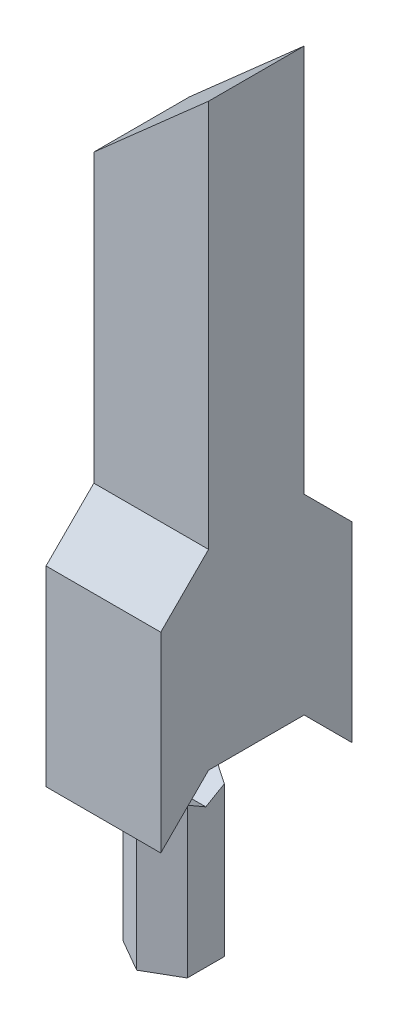
ISO-10303-21;
HEADER;
FILE_DESCRIPTION(('STEP AP214'),'2;1');
FILE_NAME('part.step','',(''),(''),'','','');
FILE_SCHEMA(('AUTOMOTIVE_DESIGN { 1 0 10303 214 1 1 1 1 }'));
ENDSEC;
DATA;
#1=APPLICATION_CONTEXT('core data for automotive mechanical design processes');
#2=APPLICATION_PROTOCOL_DEFINITION('international standard','automotive_design',2000,#1);
#3=PRODUCT_CONTEXT('',#1,'mechanical');
#4=PRODUCT('Part','Part','',(#3));
#5=PRODUCT_RELATED_PRODUCT_CATEGORY('part','',(#4));
#6=PRODUCT_DEFINITION_FORMATION('','',#4);
#7=PRODUCT_DEFINITION_CONTEXT('part definition',#1,'design');
#8=PRODUCT_DEFINITION('design','',#6,#7);
#9=PRODUCT_DEFINITION_SHAPE('','',#8);
#10=(LENGTH_UNIT() NAMED_UNIT(*) SI_UNIT(.MILLI.,.METRE.));
#11=(NAMED_UNIT(*) PLANE_ANGLE_UNIT() SI_UNIT($,.RADIAN.));
#12=(NAMED_UNIT(*) SI_UNIT($,.STERADIAN.) SOLID_ANGLE_UNIT());
#13=UNCERTAINTY_MEASURE_WITH_UNIT(LENGTH_MEASURE(1.E-05),#10,'distance_accuracy_value','');
#14=(GEOMETRIC_REPRESENTATION_CONTEXT(3) GLOBAL_UNCERTAINTY_ASSIGNED_CONTEXT((#13)) GLOBAL_UNIT_ASSIGNED_CONTEXT((#10,
#11,#12)) REPRESENTATION_CONTEXT('',''));
#15=CARTESIAN_POINT('',(0.,0.,0.));
#16=DIRECTION('',(0.,0.,1.));
#17=DIRECTION('',(1.,0.,0.));
#18=AXIS2_PLACEMENT_3D('',#15,#16,#17);
#19=CARTESIAN_POINT('',(0.,0.,-5.));
#20=DIRECTION('',(0.,0.,-1.));
#21=DIRECTION('',(-1.,0.,0.));
#22=AXIS2_PLACEMENT_3D('',#19,#20,#21);
#23=PLANE('',#22);
#24=DIRECTION('',(0.,1.,0.));
#25=VECTOR('',#24,1.);
#26=CARTESIAN_POINT('',(8.64415156033534,60.6066017177983,-5.));
#27=LINE('',#26,#25);
#28=CARTESIAN_POINT('',(8.64415156033527,20.0032863485874,-5.00000000000006));
#29=VERTEX_POINT('',#28);
#30=CARTESIAN_POINT('',(8.64415156033534,60.6066017177983,-5.));
#31=VERTEX_POINT('',#30);
#32=EDGE_CURVE('E305',#29,#31,#27,.T.);
#33=ORIENTED_EDGE('',*,*,#32,.F.);
#34=DIRECTION('',(-1.,0.,0.));
#35=VECTOR('',#34,1.);
#36=CARTESIAN_POINT('',(8.64415156033527,20.0032863485874,-5.00000000000006));
#37=LINE('',#36,#35);
#38=CARTESIAN_POINT('',(-3.35584843966466,20.0032863485874,-5.));
#39=VERTEX_POINT('',#38);
#40=EDGE_CURVE('E223',#29,#39,#37,.T.);
#41=ORIENTED_EDGE('',*,*,#40,.T.);
#42=DIRECTION('',(0.,-1.,0.));
#43=VECTOR('',#42,1.);
#44=CARTESIAN_POINT('',(-3.35584843966466,0.,-5.));
#45=LINE('',#44,#43);
#46=CARTESIAN_POINT('',(-3.35584843966466,50.,-5.));
#47=VERTEX_POINT('',#46);
#48=EDGE_CURVE('E293',#47,#39,#45,.T.);
#49=ORIENTED_EDGE('',*,*,#48,.F.);
#50=DIRECTION('',(-0.749268649265351,-0.662266178532526,0.));
#51=VECTOR('',#50,1.);
#52=CARTESIAN_POINT('',(-3.35584843966466,50.,-5.));
#53=LINE('',#52,#51);
#54=EDGE_CURVE('E308',#31,#47,#53,.T.);
#55=ORIENTED_EDGE('',*,*,#54,.F.);
#56=EDGE_LOOP('',(#33,#41,#49,#55));
#57=FACE_BOUND('',#56,.T.);
#58=ADVANCED_FACE('F39',(#57),#23,.T.);
#59=CARTESIAN_POINT('',(0.,0.,5.));
#60=DIRECTION('',(0.,0.,-1.));
#61=DIRECTION('',(-1.,0.,0.));
#62=AXIS2_PLACEMENT_3D('',#59,#60,#61);
#63=PLANE('',#62);
#64=DIRECTION('',(-1.,0.,0.));
#65=VECTOR('',#64,1.);
#66=CARTESIAN_POINT('',(8.64415156033537,20.0032863485874,4.99999999999988));
#67=LINE('',#66,#65);
#68=CARTESIAN_POINT('',(8.64415156033535,20.0032863485874,5.));
#69=VERTEX_POINT('',#68);
#70=CARTESIAN_POINT('',(-3.35584843966463,20.0032863485874,5.));
#71=VERTEX_POINT('',#70);
#72=EDGE_CURVE('E63',#69,#71,#67,.T.);
#73=ORIENTED_EDGE('',*,*,#72,.F.);
#74=DIRECTION('',(0.,1.,0.));
#75=VECTOR('',#74,1.);
#76=CARTESIAN_POINT('',(8.64415156033534,60.6066017177983,5.));
#77=LINE('',#76,#75);
#78=CARTESIAN_POINT('',(8.64415156033534,60.6066017177983,5.));
#79=VERTEX_POINT('',#78);
#80=EDGE_CURVE('E292',#69,#79,#77,.T.);
#81=ORIENTED_EDGE('',*,*,#80,.T.);
#82=DIRECTION('',(-0.749268649265351,-0.662266178532526,0.));
#83=VECTOR('',#82,1.);
#84=CARTESIAN_POINT('',(-3.35584843966466,50.,5.));
#85=LINE('',#84,#83);
#86=CARTESIAN_POINT('',(-3.35584843966466,50.,5.));
#87=VERTEX_POINT('',#86);
#88=EDGE_CURVE('E296',#79,#87,#85,.T.);
#89=ORIENTED_EDGE('',*,*,#88,.T.);
#90=DIRECTION('',(0.,-1.,0.));
#91=VECTOR('',#90,1.);
#92=CARTESIAN_POINT('',(-3.35584843966466,0.,5.));
#93=LINE('',#92,#91);
#94=EDGE_CURVE('E299',#87,#71,#93,.T.);
#95=ORIENTED_EDGE('',*,*,#94,.T.);
#96=EDGE_LOOP('',(#73,#81,#89,#95));
#97=FACE_BOUND('',#96,.T.);
#98=ADVANCED_FACE('F524',(#97),#63,.F.);
#99=CARTESIAN_POINT('',(6.64415156033532,-5.,0.));
#100=DIRECTION('',(-1.,0.,0.));
#101=DIRECTION('',(0.,0.,1.));
#102=AXIS2_PLACEMENT_3D('',#99,#100,#101);
#103=CYLINDRICAL_SURFACE('',#102,2.);
#104=CARTESIAN_POINT('',(-6.71169687932933,-5.,0.));
#105=DIRECTION('',(-0.499999999999995,0.,0.866025403784441));
#106=DIRECTION('',(-0.866025403784442,0.,-0.499999999999995));
#107=AXIS2_PLACEMENT_3D('',#104,#105,#106);
#108=ELLIPSE('',#107,3.99999999999997,2.);
#109=CARTESIAN_POINT('',(-3.35584843966466,-5.49607837082464,1.93750000000003));
#110=VERTEX_POINT('',#109);
#111=CARTESIAN_POINT('',(-3.35584843966466,-4.50392162917536,1.93750000000003));
#112=VERTEX_POINT('',#111);
#113=EDGE_CURVE('E399',#110,#112,#108,.T.);
#114=ORIENTED_EDGE('',*,*,#113,.T.);
#115=CARTESIAN_POINT('',(-3.35584843966468,-5.,0.));
#116=DIRECTION('',(-1.,0.,0.));
#117=DIRECTION('',(0.,0.,1.));
#118=AXIS2_PLACEMENT_3D('',#115,#116,#117);
#119=CIRCLE('',#118,2.);
#120=CARTESIAN_POINT('',(-3.3558484396647,-4.50392162917537,-1.93749999999996));
#121=VERTEX_POINT('',#120);
#122=EDGE_CURVE('E393',#112,#121,#119,.T.);
#123=ORIENTED_EDGE('',*,*,#122,.T.);
#124=CARTESIAN_POINT('',(-6.71169687932939,-5.,0.));
#125=DIRECTION('',(-0.500000000000007,0.,-0.866025403784435));
#126=DIRECTION('',(-0.866025403784435,0.,0.500000000000007));
#127=AXIS2_PLACEMENT_3D('',#124,#125,#126);
#128=ELLIPSE('',#127,4.00000000000002,2.);
#129=CARTESIAN_POINT('',(-3.3558484396647,-5.49607837082464,-1.93749999999996));
#130=VERTEX_POINT('',#129);
#131=EDGE_CURVE('E396',#121,#130,#128,.T.);
#132=ORIENTED_EDGE('',*,*,#131,.T.);
#133=EDGE_CURVE('E392',#130,#110,#119,.T.);
#134=ORIENTED_EDGE('',*,*,#133,.T.);
#135=EDGE_LOOP('',(#114,#123,#132,#134));
#136=FACE_BOUND('',#135,.T.);
#137=CARTESIAN_POINT('',(-0.644151560335321,-5.,0.));
#138=DIRECTION('',(1.,0.,0.));
#139=DIRECTION('',(0.,0.,-1.));
#140=AXIS2_PLACEMENT_3D('',#137,#138,#139);
#141=CIRCLE('',#140,2.);
#142=CARTESIAN_POINT('',(-0.644151560335327,-5.,-1.99999999999999));
#143=VERTEX_POINT('',#142);
#144=EDGE_CURVE('E369',#143,#143,#141,.F.);
#145=ORIENTED_EDGE('',*,*,#144,.F.);
#146=EDGE_LOOP('',(#145));
#147=FACE_BOUND('',#146,.T.);
#148=ADVANCED_FACE('F584',(#136,#147),#103,.F.);
#149=CARTESIAN_POINT('',(-3.3558484396647,-23.,-1.93749999999996));
#150=DIRECTION('',(-1.,0.,0.));
#151=DIRECTION('',(0.,0.,1.));
#152=AXIS2_PLACEMENT_3D('',#149,#150,#151);
#153=PLANE('',#152);
#154=ORIENTED_EDGE('',*,*,#122,.F.);
#155=DIRECTION('',(0.,1.,0.));
#156=VECTOR('',#155,1.);
#157=CARTESIAN_POINT('',(-3.35584843966466,-23.,1.93750000000003));
#158=LINE('',#157,#156);
#159=CARTESIAN_POINT('',(-3.35584843966466,0.,1.93750000000003));
#160=VERTEX_POINT('',#159);
#161=EDGE_CURVE('E452',#112,#160,#158,.T.);
#162=ORIENTED_EDGE('',*,*,#161,.T.);
#163=DIRECTION('',(0.,0.,-1.));
#164=VECTOR('',#163,1.);
#165=CARTESIAN_POINT('',(-3.35584843966466,0.,5.));
#166=LINE('',#165,#164);
#167=CARTESIAN_POINT('',(-3.35584843966466,0.,5.));
#168=VERTEX_POINT('',#167);
#169=EDGE_CURVE('E314',#168,#160,#166,.T.);
#170=ORIENTED_EDGE('',*,*,#169,.F.);
#171=DIRECTION('',(0.,-0.707106781186546,0.707106781186549));
#172=VECTOR('',#171,1.);
#173=CARTESIAN_POINT('',(-3.35584843966463,0.,5.));
#174=LINE('',#173,#172);
#175=CARTESIAN_POINT('',(-3.35584843966458,-4.99999999999998,10.));
#176=VERTEX_POINT('',#175);
#177=EDGE_CURVE('E253',#168,#176,#174,.T.);
#178=ORIENTED_EDGE('',*,*,#177,.T.);
#179=DIRECTION('',(0.,1.,0.));
#180=VECTOR('',#179,1.);
#181=CARTESIAN_POINT('',(-3.35584843966458,-4.99999999999998,10.));
#182=LINE('',#181,#180);
#183=CARTESIAN_POINT('',(-3.35584843966458,15.0032863485874,10.));
#184=VERTEX_POINT('',#183);
#185=EDGE_CURVE('E273',#176,#184,#182,.T.);
#186=ORIENTED_EDGE('',*,*,#185,.T.);
#187=DIRECTION('',(0.,0.707106781186546,-0.707106781186549));
#188=VECTOR('',#187,1.);
#189=CARTESIAN_POINT('',(-3.35584843966458,15.0032863485874,10.));
#190=LINE('',#189,#188);
#191=EDGE_CURVE('E261',#184,#71,#190,.T.);
#192=ORIENTED_EDGE('',*,*,#191,.T.);
#193=ORIENTED_EDGE('',*,*,#94,.F.);
#194=DIRECTION('',(0.,0.,-1.));
#195=VECTOR('',#194,1.);
#196=CARTESIAN_POINT('',(-3.35584843966466,50.,5.));
#197=LINE('',#196,#195);
#198=EDGE_CURVE('E318',#87,#47,#197,.T.);
#199=ORIENTED_EDGE('',*,*,#198,.T.);
#200=ORIENTED_EDGE('',*,*,#48,.T.);
#201=DIRECTION('',(0.,-0.707106781186546,-0.707106781186549));
#202=VECTOR('',#201,1.);
#203=CARTESIAN_POINT('',(-3.35584843966478,15.0032863485874,-9.99999999999993));
#204=LINE('',#203,#202);
#205=CARTESIAN_POINT('',(-3.35584843966478,15.0032863485874,-9.99999999999993));
#206=VERTEX_POINT('',#205);
#207=EDGE_CURVE('E55',#39,#206,#204,.T.);
#208=ORIENTED_EDGE('',*,*,#207,.T.);
#209=DIRECTION('',(0.,-1.,0.));
#210=VECTOR('',#209,1.);
#211=CARTESIAN_POINT('',(-3.35584843966478,-4.99999999999998,-9.99999999999993));
#212=LINE('',#211,#210);
#213=CARTESIAN_POINT('',(-3.35584843966478,-4.99999999999998,-9.99999999999993));
#214=VERTEX_POINT('',#213);
#215=EDGE_CURVE('E246',#206,#214,#212,.T.);
#216=ORIENTED_EDGE('',*,*,#215,.T.);
#217=DIRECTION('',(0.,0.707106781186546,0.707106781186549));
#218=VECTOR('',#217,1.);
#219=CARTESIAN_POINT('',(-3.35584843966473,0.,-4.99999999999993));
#220=LINE('',#219,#218);
#221=CARTESIAN_POINT('',(-3.35584843966473,0.,-4.99999999999993));
#222=VERTEX_POINT('',#221);
#223=EDGE_CURVE('E217',#214,#222,#220,.T.);
#224=ORIENTED_EDGE('',*,*,#223,.T.);
#225=CARTESIAN_POINT('',(-3.35584843966466,0.,-1.93749999999998));
#226=VERTEX_POINT('',#225);
#227=EDGE_CURVE('E302',#226,#222,#166,.T.);
#228=ORIENTED_EDGE('',*,*,#227,.F.);
#229=DIRECTION('',(0.,1.,0.));
#230=VECTOR('',#229,1.);
#231=CARTESIAN_POINT('',(-3.3558484396647,-23.,-1.93749999999996));
#232=LINE('',#231,#230);
#233=EDGE_CURVE('E457',#121,#226,#232,.T.);
#234=ORIENTED_EDGE('',*,*,#233,.F.);
#235=EDGE_LOOP('',(#154,#162,#170,#178,#186,#192,#193,#199,#200,#208,#216,#224,#228,#234));
#236=FACE_BOUND('',#235,.T.);
#237=ADVANCED_FACE('F512',(#236),#153,.T.);
#238=CARTESIAN_POINT('',(3.35584843966469,-23.,1.93749999999998));
#239=DIRECTION('',(1.,0.,0.));
#240=DIRECTION('',(0.,0.,-1.));
#241=AXIS2_PLACEMENT_3D('',#238,#239,#240);
#242=PLANE('',#241);
#243=DIRECTION('',(0.,-0.5,0.866025403784438));
#244=VECTOR('',#243,1.);
#245=CARTESIAN_POINT('',(3.35584843966468,-1.53589838486225,0.));
#246=LINE('',#245,#244);
#247=CARTESIAN_POINT('',(3.35584843966468,-1.53589838486225,0.));
#248=VERTEX_POINT('',#247);
#249=CARTESIAN_POINT('',(3.35584843966469,-2.65451453141715,1.93749999999998));
#250=VERTEX_POINT('',#249);
#251=EDGE_CURVE('E334',#248,#250,#246,.T.);
#252=ORIENTED_EDGE('',*,*,#251,.F.);
#253=DIRECTION('',(0.,0.5,0.866025403784439));
#254=VECTOR('',#253,1.);
#255=CARTESIAN_POINT('',(3.35584843966467,-3.26794919243112,-3.00000000000003));
#256=LINE('',#255,#254);
#257=CARTESIAN_POINT('',(3.35584843966467,-2.65451453141713,-1.93750000000001));
#258=VERTEX_POINT('',#257);
#259=EDGE_CURVE('E360',#258,#248,#256,.T.);
#260=ORIENTED_EDGE('',*,*,#259,.F.);
#261=DIRECTION('',(0.,1.,0.));
#262=VECTOR('',#261,1.);
#263=CARTESIAN_POINT('',(3.35584843966467,-23.,-1.93750000000001));
#264=LINE('',#263,#262);
#265=CARTESIAN_POINT('',(3.35584843966467,0.,-1.93750000000001));
#266=VERTEX_POINT('',#265);
#267=EDGE_CURVE('E465',#258,#266,#264,.T.);
#268=ORIENTED_EDGE('',*,*,#267,.T.);
#269=DIRECTION('',(0.,0.,-1.));
#270=VECTOR('',#269,1.);
#271=CARTESIAN_POINT('',(3.35584843966469,0.,1.93749999999998));
#272=LINE('',#271,#270);
#273=CARTESIAN_POINT('',(3.35584843966469,0.,1.93749999999998));
#274=VERTEX_POINT('',#273);
#275=EDGE_CURVE('E436',#274,#266,#272,.T.);
#276=ORIENTED_EDGE('',*,*,#275,.F.);
#277=DIRECTION('',(0.,1.,0.));
#278=VECTOR('',#277,1.);
#279=CARTESIAN_POINT('',(3.35584843966469,-23.,1.93749999999998));
#280=LINE('',#279,#278);
#281=EDGE_CURVE('E470',#250,#274,#280,.T.);
#282=ORIENTED_EDGE('',*,*,#281,.F.);
#283=EDGE_LOOP('',(#252,#260,#268,#276,#282));
#284=FACE_BOUND('',#283,.T.);
#285=ADVANCED_FACE('F551',(#284),#242,.T.);
#286=CARTESIAN_POINT('',(-3.35584843966466,-23.,1.93750000000003));
#287=DIRECTION('',(-0.499999999999995,0.,0.866025403784441));
#288=DIRECTION('',(0.866025403784442,0.,0.499999999999995));
#289=AXIS2_PLACEMENT_3D('',#286,#287,#288);
#290=PLANE('',#289);
#291=ORIENTED_EDGE('',*,*,#113,.F.);
#292=CARTESIAN_POINT('',(-3.35584843966466,-23.,1.93750000000003));
#293=VERTEX_POINT('',#292);
#294=EDGE_CURVE('E447',#293,#110,#158,.T.);
#295=ORIENTED_EDGE('',*,*,#294,.F.);
#296=DIRECTION('',(0.866025403784441,0.,0.499999999999995));
#297=VECTOR('',#296,1.);
#298=CARTESIAN_POINT('',(-3.35584843966466,-23.,1.93750000000003));
#299=LINE('',#298,#297);
#300=CARTESIAN_POINT('',(0.,-23.,3.87499999999998));
#301=VERTEX_POINT('',#300);
#302=EDGE_CURVE('E403',#293,#301,#299,.T.);
#303=ORIENTED_EDGE('',*,*,#302,.T.);
#304=DIRECTION('',(0.,1.,0.));
#305=VECTOR('',#304,1.);
#306=CARTESIAN_POINT('',(0.,-23.,3.87499999999998));
#307=LINE('',#306,#305);
#308=CARTESIAN_POINT('',(0.,0.,3.87499999999998));
#309=VERTEX_POINT('',#308);
#310=EDGE_CURVE('E428',#301,#309,#307,.T.);
#311=ORIENTED_EDGE('',*,*,#310,.T.);
#312=DIRECTION('',(0.866025403784441,0.,0.499999999999995));
#313=VECTOR('',#312,1.);
#314=CARTESIAN_POINT('',(-3.35584843966466,0.,1.93750000000003));
#315=LINE('',#314,#313);
#316=EDGE_CURVE('E402',#160,#309,#315,.T.);
#317=ORIENTED_EDGE('',*,*,#316,.F.);
#318=ORIENTED_EDGE('',*,*,#161,.F.);
#319=EDGE_LOOP('',(#291,#295,#303,#311,#317,#318));
#320=FACE_BOUND('',#319,.T.);
#321=ADVANCED_FACE('F41',(#320),#290,.T.);
#322=ORIENTED_EDGE('',*,*,#133,.F.);
#323=CARTESIAN_POINT('',(-3.3558484396647,-23.,-1.93749999999996));
#324=VERTEX_POINT('',#323);
#325=EDGE_CURVE('E453',#324,#130,#232,.T.);
#326=ORIENTED_EDGE('',*,*,#325,.F.);
#327=DIRECTION('',(0.,0.,1.));
#328=VECTOR('',#327,1.);
#329=CARTESIAN_POINT('',(-3.3558484396647,-23.,-1.93749999999996));
#330=LINE('',#329,#328);
#331=EDGE_CURVE('E424',#324,#293,#330,.T.);
#332=ORIENTED_EDGE('',*,*,#331,.T.);
#333=ORIENTED_EDGE('',*,*,#294,.T.);
#334=EDGE_LOOP('',(#322,#326,#332,#333));
#335=FACE_BOUND('',#334,.T.);
#336=ADVANCED_FACE('F587',(#335),#153,.T.);
#337=CARTESIAN_POINT('',(0.,-23.,-3.87499999999998));
#338=DIRECTION('',(-0.500000000000007,0.,-0.866025403784435));
#339=DIRECTION('',(-0.866025403784435,0.,0.500000000000007));
#340=AXIS2_PLACEMENT_3D('',#337,#338,#339);
#341=PLANE('',#340);
#342=ORIENTED_EDGE('',*,*,#131,.F.);
#343=ORIENTED_EDGE('',*,*,#233,.T.);
#344=DIRECTION('',(-0.866025403784435,0.,0.500000000000007));
#345=VECTOR('',#344,1.);
#346=CARTESIAN_POINT('',(0.,0.,-3.87499999999998));
#347=LINE('',#346,#345);
#348=CARTESIAN_POINT('',(0.,0.,-3.87499999999998));
#349=VERTEX_POINT('',#348);
#350=EDGE_CURVE('E408',#349,#226,#347,.T.);
#351=ORIENTED_EDGE('',*,*,#350,.F.);
#352=DIRECTION('',(0.,1.,0.));
#353=VECTOR('',#352,1.);
#354=CARTESIAN_POINT('',(0.,-23.,-3.87499999999998));
#355=LINE('',#354,#353);
#356=CARTESIAN_POINT('',(0.,-23.,-3.87499999999998));
#357=VERTEX_POINT('',#356);
#358=EDGE_CURVE('E458',#357,#349,#355,.T.);
#359=ORIENTED_EDGE('',*,*,#358,.F.);
#360=DIRECTION('',(-0.866025403784435,0.,0.500000000000007));
#361=VECTOR('',#360,1.);
#362=CARTESIAN_POINT('',(0.,-23.,-3.87499999999998));
#363=LINE('',#362,#361);
#364=EDGE_CURVE('E420',#357,#324,#363,.T.);
#365=ORIENTED_EDGE('',*,*,#364,.T.);
#366=ORIENTED_EDGE('',*,*,#325,.T.);
#367=EDGE_LOOP('',(#342,#343,#351,#359,#365,#366));
#368=FACE_BOUND('',#367,.T.);
#369=ADVANCED_FACE('F580',(#368),#341,.T.);
#370=CARTESIAN_POINT('',(3.35584843966467,-23.,-1.93750000000001));
#371=DIRECTION('',(0.499999999999995,0.,-0.866025403784442));
#372=DIRECTION('',(-0.866025403784442,0.,-0.499999999999995));
#373=AXIS2_PLACEMENT_3D('',#370,#371,#372);
#374=PLANE('',#373);
#375=DIRECTION('',(0.832050294337847,0.277350098112613,0.480384461415257));
#376=VECTOR('',#375,1.);
#377=CARTESIAN_POINT('',(-1.33926359154675,-4.21955187515426,-4.64822419509534));
#378=LINE('',#377,#376);
#379=CARTESIAN_POINT('',(1.51554445662268,-3.26794919243112,-3.00000000000003));
#380=VERTEX_POINT('',#379);
#381=EDGE_CURVE('E11',#380,#258,#378,.T.);
#382=ORIENTED_EDGE('',*,*,#381,.F.);
#383=DIRECTION('',(0.,1.,0.));
#384=VECTOR('',#383,1.);
#385=CARTESIAN_POINT('',(1.51554445662267,-23.,-3.00000000000003));
#386=LINE('',#385,#384);
#387=CARTESIAN_POINT('',(1.51554445662268,-6.73205080756888,-3.00000000000003));
#388=VERTEX_POINT('',#387);
#389=EDGE_CURVE('E48',#388,#380,#386,.T.);
#390=ORIENTED_EDGE('',*,*,#389,.F.);
#391=DIRECTION('',(-0.832050294337847,0.277350098112614,-0.480384461415257));
#392=VECTOR('',#391,1.);
#393=CARTESIAN_POINT('',(6.96842871614555,-8.54967889407649,0.148224195095333));
#394=LINE('',#393,#392);
#395=CARTESIAN_POINT('',(3.35584843966467,-7.34548546858287,-1.9375));
#396=VERTEX_POINT('',#395);
#397=EDGE_CURVE('E389',#396,#388,#394,.T.);
#398=ORIENTED_EDGE('',*,*,#397,.F.);
#399=CARTESIAN_POINT('',(3.35584843966467,-23.,-1.93750000000001));
#400=VERTEX_POINT('',#399);
#401=EDGE_CURVE('E461',#400,#396,#264,.T.);
#402=ORIENTED_EDGE('',*,*,#401,.F.);
#403=DIRECTION('',(-0.866025403784441,0.,-0.499999999999995));
#404=VECTOR('',#403,1.);
#405=CARTESIAN_POINT('',(3.35584843966467,-23.,-1.93750000000001));
#406=LINE('',#405,#404);
#407=EDGE_CURVE('E416',#400,#357,#406,.T.);
#408=ORIENTED_EDGE('',*,*,#407,.T.);
#409=ORIENTED_EDGE('',*,*,#358,.T.);
#410=DIRECTION('',(-0.866025403784441,0.,-0.499999999999995));
#411=VECTOR('',#410,1.);
#412=CARTESIAN_POINT('',(3.35584843966467,0.,-1.93750000000001));
#413=LINE('',#412,#411);
#414=EDGE_CURVE('E440',#266,#349,#413,.T.);
#415=ORIENTED_EDGE('',*,*,#414,.F.);
#416=ORIENTED_EDGE('',*,*,#267,.F.);
#417=EDGE_LOOP('',(#382,#390,#398,#402,#408,#409,#415,#416));
#418=FACE_BOUND('',#417,.T.);
#419=ADVANCED_FACE('F496',(#418),#374,.T.);
#420=DIRECTION('',(0.,-0.5,-0.866025403784439));
#421=VECTOR('',#420,1.);
#422=CARTESIAN_POINT('',(3.35584843966469,-6.73205080756888,2.99999999999997));
#423=LINE('',#422,#421);
#424=CARTESIAN_POINT('',(3.35584843966469,-7.34548546858284,1.93749999999998));
#425=VERTEX_POINT('',#424);
#426=CARTESIAN_POINT('',(3.35584843966468,-8.46410161513776,0.));
#427=VERTEX_POINT('',#426);
#428=EDGE_CURVE('E328',#425,#427,#423,.T.);
#429=ORIENTED_EDGE('',*,*,#428,.F.);
#430=CARTESIAN_POINT('',(3.35584843966469,-23.,1.93749999999998));
#431=VERTEX_POINT('',#430);
#432=EDGE_CURVE('E466',#431,#425,#280,.T.);
#433=ORIENTED_EDGE('',*,*,#432,.F.);
#434=DIRECTION('',(0.,0.,-1.));
#435=VECTOR('',#434,1.);
#436=CARTESIAN_POINT('',(3.35584843966469,-23.,1.93749999999998));
#437=LINE('',#436,#435);
#438=EDGE_CURVE('E412',#431,#400,#437,.T.);
#439=ORIENTED_EDGE('',*,*,#438,.T.);
#440=ORIENTED_EDGE('',*,*,#401,.T.);
#441=DIRECTION('',(0.,0.5,-0.866025403784439));
#442=VECTOR('',#441,1.);
#443=CARTESIAN_POINT('',(3.35584843966468,-8.46410161513776,0.));
#444=LINE('',#443,#442);
#445=EDGE_CURVE('E357',#427,#396,#444,.T.);
#446=ORIENTED_EDGE('',*,*,#445,.F.);
#447=EDGE_LOOP('',(#429,#433,#439,#440,#446));
#448=FACE_BOUND('',#447,.T.);
#449=ADVANCED_FACE('F572',(#448),#242,.T.);
#450=CARTESIAN_POINT('',(0.,-23.,3.87499999999998));
#451=DIRECTION('',(0.500000000000001,0.,0.866025403784438));
#452=DIRECTION('',(0.866025403784438,0.,-0.500000000000001));
#453=AXIS2_PLACEMENT_3D('',#450,#451,#452);
#454=PLANE('',#453);
#455=DIRECTION('',(0.832050294337843,-0.277350098112613,-0.480384461415262));
#456=VECTOR('',#455,1.);
#457=CARTESIAN_POINT('',(3.87072246414738,-7.51711014341041,1.64023734336615));
#458=LINE('',#457,#456);
#459=CARTESIAN_POINT('',(1.51554445662278,-6.73205080756888,2.99999999999997));
#460=VERTEX_POINT('',#459);
#461=EDGE_CURVE('E481',#460,#425,#458,.T.);
#462=ORIENTED_EDGE('',*,*,#461,.F.);
#463=DIRECTION('',(0.,-1.,0.));
#464=VECTOR('',#463,1.);
#465=CARTESIAN_POINT('',(1.51554445662278,-23.,2.99999999999997));
#466=LINE('',#465,#464);
#467=CARTESIAN_POINT('',(1.51554445662277,-3.26794919243112,2.99999999999997));
#468=VERTEX_POINT('',#467);
#469=EDGE_CURVE('E478',#468,#460,#466,.T.);
#470=ORIENTED_EDGE('',*,*,#469,.F.);
#471=DIRECTION('',(-0.832050294337843,-0.277350098112614,0.480384461415262));
#472=VECTOR('',#471,1.);
#473=CARTESIAN_POINT('',(-4.4369698435449,-5.25212062582034,6.43668573355688));
#474=LINE('',#473,#472);
#475=EDGE_CURVE('E451',#250,#468,#474,.T.);
#476=ORIENTED_EDGE('',*,*,#475,.F.);
#477=ORIENTED_EDGE('',*,*,#281,.T.);
#478=DIRECTION('',(0.866025403784438,0.,-0.500000000000001));
#479=VECTOR('',#478,1.);
#480=CARTESIAN_POINT('',(0.,0.,3.87499999999998));
#481=LINE('',#480,#479);
#482=EDGE_CURVE('E432',#309,#274,#481,.T.);
#483=ORIENTED_EDGE('',*,*,#482,.F.);
#484=ORIENTED_EDGE('',*,*,#310,.F.);
#485=DIRECTION('',(0.866025403784438,0.,-0.500000000000001));
#486=VECTOR('',#485,1.);
#487=CARTESIAN_POINT('',(0.,-23.,3.87499999999998));
#488=LINE('',#487,#486);
#489=EDGE_CURVE('E407',#301,#431,#488,.T.);
#490=ORIENTED_EDGE('',*,*,#489,.T.);
#491=ORIENTED_EDGE('',*,*,#432,.T.);
#492=EDGE_LOOP('',(#462,#470,#476,#477,#483,#484,#490,#491));
#493=FACE_BOUND('',#492,.T.);
#494=ADVANCED_FACE('F547',(#493),#454,.T.);
#495=CARTESIAN_POINT('',(0.,-23.,0.));
#496=DIRECTION('',(0.,1.,0.));
#497=DIRECTION('',(0.,0.,1.));
#498=AXIS2_PLACEMENT_3D('',#495,#496,#497);
#499=PLANE('',#498);
#500=ORIENTED_EDGE('',*,*,#302,.F.);
#501=ORIENTED_EDGE('',*,*,#331,.F.);
#502=ORIENTED_EDGE('',*,*,#364,.F.);
#503=ORIENTED_EDGE('',*,*,#407,.F.);
#504=ORIENTED_EDGE('',*,*,#438,.F.);
#505=ORIENTED_EDGE('',*,*,#489,.F.);
#506=EDGE_LOOP('',(#500,#501,#502,#503,#504,#505));
#507=FACE_BOUND('',#506,.T.);
#508=ADVANCED_FACE('F575',(#507),#499,.F.);
#509=CARTESIAN_POINT('',(-0.64415156033532,0.,0.));
#510=DIRECTION('',(1.,0.,0.));
#511=DIRECTION('',(0.,0.,-1.));
#512=AXIS2_PLACEMENT_3D('',#509,#510,#511);
#513=PLANE('',#512);
#514=DIRECTION('',(0.,-0.5,-0.866025403784439));
#515=VECTOR('',#514,1.);
#516=CARTESIAN_POINT('',(-0.64415156033531,-6.73205080756888,2.99999999999998));
#517=LINE('',#516,#515);
#518=CARTESIAN_POINT('',(-0.64415156033531,-6.73205080756888,2.99999999999998));
#519=VERTEX_POINT('',#518);
#520=CARTESIAN_POINT('',(-0.64415156033532,-8.46410161513776,0.));
#521=VERTEX_POINT('',#520);
#522=EDGE_CURVE('E329',#519,#521,#517,.T.);
#523=ORIENTED_EDGE('',*,*,#522,.T.);
#524=DIRECTION('',(0.,0.5,-0.866025403784439));
#525=VECTOR('',#524,1.);
#526=CARTESIAN_POINT('',(-0.64415156033532,-8.46410161513776,0.));
#527=LINE('',#526,#525);
#528=CARTESIAN_POINT('',(-0.644151560335331,-6.73205080756888,-3.00000000000002));
#529=VERTEX_POINT('',#528);
#530=EDGE_CURVE('E333',#521,#529,#527,.T.);
#531=ORIENTED_EDGE('',*,*,#530,.T.);
#532=DIRECTION('',(0.,1.,0.));
#533=VECTOR('',#532,1.);
#534=CARTESIAN_POINT('',(-0.644151560335331,-6.73205080756888,-3.00000000000002));
#535=LINE('',#534,#533);
#536=CARTESIAN_POINT('',(-0.644151560335331,-3.26794919243112,-3.00000000000002));
#537=VERTEX_POINT('',#536);
#538=EDGE_CURVE('E338',#529,#537,#535,.T.);
#539=ORIENTED_EDGE('',*,*,#538,.T.);
#540=DIRECTION('',(0.,0.5,0.866025403784439));
#541=VECTOR('',#540,1.);
#542=CARTESIAN_POINT('',(-0.644151560335331,-3.26794919243112,-3.00000000000002));
#543=LINE('',#542,#541);
#544=CARTESIAN_POINT('',(-0.64415156033532,-1.53589838486225,0.));
#545=VERTEX_POINT('',#544);
#546=EDGE_CURVE('E342',#537,#545,#543,.T.);
#547=ORIENTED_EDGE('',*,*,#546,.T.);
#548=DIRECTION('',(0.,-0.5,0.866025403784438));
#549=VECTOR('',#548,1.);
#550=CARTESIAN_POINT('',(-0.64415156033532,-1.53589838486225,0.));
#551=LINE('',#550,#549);
#552=CARTESIAN_POINT('',(-0.64415156033531,-3.26794919243112,2.99999999999998));
#553=VERTEX_POINT('',#552);
#554=EDGE_CURVE('E346',#545,#553,#551,.T.);
#555=ORIENTED_EDGE('',*,*,#554,.T.);
#556=DIRECTION('',(0.,-1.,0.));
#557=VECTOR('',#556,1.);
#558=CARTESIAN_POINT('',(-0.64415156033531,-3.26794919243112,2.99999999999998));
#559=LINE('',#558,#557);
#560=EDGE_CURVE('E350',#553,#519,#559,.T.);
#561=ORIENTED_EDGE('',*,*,#560,.T.);
#562=EDGE_LOOP('',(#523,#531,#539,#547,#555,#561));
#563=FACE_BOUND('',#562,.T.);
#564=ORIENTED_EDGE('',*,*,#144,.T.);
#565=EDGE_LOOP('',(#564));
#566=FACE_BOUND('',#565,.T.);
#567=ADVANCED_FACE('F565',(#563,#566),#513,.T.);
#568=CARTESIAN_POINT('',(-0.64415156033531,-6.73205080756888,2.99999999999998));
#569=DIRECTION('',(0.,-0.866025403784439,0.5));
#570=DIRECTION('',(0.,-0.5,-0.866025403784439));
#571=AXIS2_PLACEMENT_3D('',#568,#569,#570);
#572=PLANE('',#571);
#573=ORIENTED_EDGE('',*,*,#461,.T.);
#574=ORIENTED_EDGE('',*,*,#428,.T.);
#575=DIRECTION('',(1.,0.,0.));
#576=VECTOR('',#575,1.);
#577=CARTESIAN_POINT('',(-0.64415156033532,-8.46410161513776,0.));
#578=LINE('',#577,#576);
#579=EDGE_CURVE('E354',#521,#427,#578,.T.);
#580=ORIENTED_EDGE('',*,*,#579,.F.);
#581=ORIENTED_EDGE('',*,*,#522,.F.);
#582=DIRECTION('',(1.,0.,0.));
#583=VECTOR('',#582,1.);
#584=CARTESIAN_POINT('',(-0.64415156033531,-6.73205080756888,2.99999999999998));
#585=LINE('',#584,#583);
#586=EDGE_CURVE('E365',#519,#460,#585,.T.);
#587=ORIENTED_EDGE('',*,*,#586,.T.);
#588=EDGE_LOOP('',(#573,#574,#580,#581,#587));
#589=FACE_BOUND('',#588,.T.);
#590=ADVANCED_FACE('F561',(#589),#572,.F.);
#591=CARTESIAN_POINT('',(-0.64415156033531,-3.26794919243112,2.99999999999998));
#592=DIRECTION('',(0.,0.,1.));
#593=DIRECTION('',(1.,0.,0.));
#594=AXIS2_PLACEMENT_3D('',#591,#592,#593);
#595=PLANE('',#594);
#596=ORIENTED_EDGE('',*,*,#469,.T.);
#597=ORIENTED_EDGE('',*,*,#586,.F.);
#598=ORIENTED_EDGE('',*,*,#560,.F.);
#599=DIRECTION('',(1.,0.,0.));
#600=VECTOR('',#599,1.);
#601=CARTESIAN_POINT('',(-0.64415156033531,-3.26794919243112,2.99999999999998));
#602=LINE('',#601,#600);
#603=EDGE_CURVE('E370',#553,#468,#602,.T.);
#604=ORIENTED_EDGE('',*,*,#603,.T.);
#605=EDGE_LOOP('',(#596,#597,#598,#604));
#606=FACE_BOUND('',#605,.T.);
#607=ADVANCED_FACE('F557',(#606),#595,.F.);
#608=CARTESIAN_POINT('',(-0.64415156033532,-1.53589838486225,0.));
#609=DIRECTION('',(0.,0.866025403784438,0.5));
#610=DIRECTION('',(0.,-0.5,0.866025403784439));
#611=AXIS2_PLACEMENT_3D('',#608,#609,#610);
#612=PLANE('',#611);
#613=ORIENTED_EDGE('',*,*,#475,.T.);
#614=ORIENTED_EDGE('',*,*,#603,.F.);
#615=ORIENTED_EDGE('',*,*,#554,.F.);
#616=DIRECTION('',(1.,0.,0.));
#617=VECTOR('',#616,1.);
#618=CARTESIAN_POINT('',(-0.64415156033532,-1.53589838486225,0.));
#619=LINE('',#618,#617);
#620=EDGE_CURVE('E374',#545,#248,#619,.T.);
#621=ORIENTED_EDGE('',*,*,#620,.T.);
#622=ORIENTED_EDGE('',*,*,#251,.T.);
#623=EDGE_LOOP('',(#613,#614,#615,#621,#622));
#624=FACE_BOUND('',#623,.T.);
#625=ADVANCED_FACE('F553',(#624),#612,.F.);
#626=CARTESIAN_POINT('',(-0.644151560335331,-3.26794919243112,-3.00000000000002));
#627=DIRECTION('',(0.,0.866025403784439,-0.5));
#628=DIRECTION('',(0.,0.5,0.866025403784439));
#629=AXIS2_PLACEMENT_3D('',#626,#627,#628);
#630=PLANE('',#629);
#631=ORIENTED_EDGE('',*,*,#381,.T.);
#632=ORIENTED_EDGE('',*,*,#259,.T.);
#633=ORIENTED_EDGE('',*,*,#620,.F.);
#634=ORIENTED_EDGE('',*,*,#546,.F.);
#635=DIRECTION('',(1.,0.,0.));
#636=VECTOR('',#635,1.);
#637=CARTESIAN_POINT('',(-0.644151560335331,-3.26794919243112,-3.00000000000002));
#638=LINE('',#637,#636);
#639=EDGE_CURVE('E378',#537,#380,#638,.T.);
#640=ORIENTED_EDGE('',*,*,#639,.T.);
#641=EDGE_LOOP('',(#631,#632,#633,#634,#640));
#642=FACE_BOUND('',#641,.T.);
#643=ADVANCED_FACE('F493',(#642),#630,.F.);
#644=CARTESIAN_POINT('',(-0.644151560335331,-6.73205080756888,-3.00000000000002));
#645=DIRECTION('',(0.,0.,-1.));
#646=DIRECTION('',(-1.,0.,0.));
#647=AXIS2_PLACEMENT_3D('',#644,#645,#646);
#648=PLANE('',#647);
#649=ORIENTED_EDGE('',*,*,#389,.T.);
#650=ORIENTED_EDGE('',*,*,#639,.F.);
#651=ORIENTED_EDGE('',*,*,#538,.F.);
#652=DIRECTION('',(1.,0.,0.));
#653=VECTOR('',#652,1.);
#654=CARTESIAN_POINT('',(-0.644151560335331,-6.73205080756888,-3.00000000000002));
#655=LINE('',#654,#653);
#656=EDGE_CURVE('E382',#529,#388,#655,.T.);
#657=ORIENTED_EDGE('',*,*,#656,.T.);
#658=EDGE_LOOP('',(#649,#650,#651,#657));
#659=FACE_BOUND('',#658,.T.);
#660=ADVANCED_FACE('F486',(#659),#648,.F.);
#661=CARTESIAN_POINT('',(-0.64415156033532,-8.46410161513776,0.));
#662=DIRECTION('',(0.,-0.866025403784439,-0.5));
#663=DIRECTION('',(0.,0.5,-0.866025403784439));
#664=AXIS2_PLACEMENT_3D('',#661,#662,#663);
#665=PLANE('',#664);
#666=ORIENTED_EDGE('',*,*,#397,.T.);
#667=ORIENTED_EDGE('',*,*,#656,.F.);
#668=ORIENTED_EDGE('',*,*,#530,.F.);
#669=ORIENTED_EDGE('',*,*,#579,.T.);
#670=ORIENTED_EDGE('',*,*,#445,.T.);
#671=EDGE_LOOP('',(#666,#667,#668,#669,#670));
#672=FACE_BOUND('',#671,.T.);
#673=ADVANCED_FACE('F568',(#672),#665,.F.);
#674=CARTESIAN_POINT('',(-3.35584843966466,0.,5.));
#675=DIRECTION('',(0.,1.,0.));
#676=DIRECTION('',(0.,0.,1.));
#677=AXIS2_PLACEMENT_3D('',#674,#675,#676);
#678=PLANE('',#677);
#679=ORIENTED_EDGE('',*,*,#169,.T.);
#680=ORIENTED_EDGE('',*,*,#316,.T.);
#681=ORIENTED_EDGE('',*,*,#482,.T.);
#682=ORIENTED_EDGE('',*,*,#275,.T.);
#683=ORIENTED_EDGE('',*,*,#414,.T.);
#684=ORIENTED_EDGE('',*,*,#350,.T.);
#685=ORIENTED_EDGE('',*,*,#227,.T.);
#686=DIRECTION('',(1.,0.,0.));
#687=VECTOR('',#686,1.);
#688=CARTESIAN_POINT('',(-3.35584843966466,0.,-5.));
#689=LINE('',#688,#687);
#690=CARTESIAN_POINT('',(8.64415156033527,0.,-5.00000000000006));
#691=VERTEX_POINT('',#690);
#692=EDGE_CURVE('E282',#222,#691,#689,.T.);
#693=ORIENTED_EDGE('',*,*,#692,.T.);
#694=DIRECTION('',(0.,0.,-1.));
#695=VECTOR('',#694,1.);
#696=CARTESIAN_POINT('',(8.64415156033535,0.,5.));
#697=LINE('',#696,#695);
#698=CARTESIAN_POINT('',(8.64415156033535,0.,5.));
#699=VERTEX_POINT('',#698);
#700=EDGE_CURVE('E233',#699,#691,#697,.T.);
#701=ORIENTED_EDGE('',*,*,#700,.F.);
#702=DIRECTION('',(1.,0.,0.));
#703=VECTOR('',#702,1.);
#704=CARTESIAN_POINT('',(-3.35584843966466,0.,5.));
#705=LINE('',#704,#703);
#706=EDGE_CURVE('E288',#168,#699,#705,.T.);
#707=ORIENTED_EDGE('',*,*,#706,.F.);
#708=EDGE_LOOP('',(#679,#680,#681,#682,#683,#684,#685,#693,#701,#707));
#709=FACE_BOUND('',#708,.T.);
#710=ADVANCED_FACE('F507',(#709),#678,.F.);
#711=CARTESIAN_POINT('',(8.64415156033534,60.6066017177983,5.));
#712=DIRECTION('',(-1.,0.,0.));
#713=DIRECTION('',(0.,-1.,0.));
#714=AXIS2_PLACEMENT_3D('',#711,#712,#713);
#715=PLANE('',#714);
#716=ORIENTED_EDGE('',*,*,#700,.T.);
#717=DIRECTION('',(0.,0.707106781186546,0.707106781186549));
#718=VECTOR('',#717,1.);
#719=CARTESIAN_POINT('',(8.64415156033527,0.,-5.00000000000006));
#720=LINE('',#719,#718);
#721=CARTESIAN_POINT('',(8.64415156033522,-4.99999999999998,-10.0000000000001));
#722=VERTEX_POINT('',#721);
#723=EDGE_CURVE('E214',#722,#691,#720,.T.);
#724=ORIENTED_EDGE('',*,*,#723,.F.);
#725=DIRECTION('',(0.,-1.,0.));
#726=VECTOR('',#725,1.);
#727=CARTESIAN_POINT('',(8.64415156033522,-4.99999999999998,-10.0000000000001));
#728=LINE('',#727,#726);
#729=CARTESIAN_POINT('',(8.64415156033522,15.0032863485874,-10.0000000000001));
#730=VERTEX_POINT('',#729);
#731=EDGE_CURVE('E230',#730,#722,#728,.T.);
#732=ORIENTED_EDGE('',*,*,#731,.F.);
#733=DIRECTION('',(0.,-0.707106781186546,-0.707106781186549));
#734=VECTOR('',#733,1.);
#735=CARTESIAN_POINT('',(8.64415156033522,15.0032863485874,-10.0000000000001));
#736=LINE('',#735,#734);
#737=EDGE_CURVE('E224',#29,#730,#736,.T.);
#738=ORIENTED_EDGE('',*,*,#737,.F.);
#739=ORIENTED_EDGE('',*,*,#32,.T.);
#740=DIRECTION('',(0.,0.,-1.));
#741=VECTOR('',#740,1.);
#742=CARTESIAN_POINT('',(8.64415156033534,60.6066017177983,5.));
#743=LINE('',#742,#741);
#744=EDGE_CURVE('E322',#79,#31,#743,.T.);
#745=ORIENTED_EDGE('',*,*,#744,.F.);
#746=ORIENTED_EDGE('',*,*,#80,.F.);
#747=DIRECTION('',(0.,0.707106781186546,-0.707106781186549));
#748=VECTOR('',#747,1.);
#749=CARTESIAN_POINT('',(8.64415156033543,15.0032863485874,9.99999999999988));
#750=LINE('',#749,#748);
#751=CARTESIAN_POINT('',(8.64415156033543,15.0032863485874,9.99999999999988));
#752=VERTEX_POINT('',#751);
#753=EDGE_CURVE('E265',#752,#69,#750,.T.);
#754=ORIENTED_EDGE('',*,*,#753,.F.);
#755=DIRECTION('',(0.,1.,0.));
#756=VECTOR('',#755,1.);
#757=CARTESIAN_POINT('',(8.64415156033543,-4.99999999999998,9.99999999999988));
#758=LINE('',#757,#756);
#759=CARTESIAN_POINT('',(8.64415156033543,-4.99999999999998,9.99999999999988));
#760=VERTEX_POINT('',#759);
#761=EDGE_CURVE('E260',#760,#752,#758,.T.);
#762=ORIENTED_EDGE('',*,*,#761,.F.);
#763=DIRECTION('',(0.,-0.707106781186546,0.707106781186549));
#764=VECTOR('',#763,1.);
#765=CARTESIAN_POINT('',(8.64415156033537,0.,4.99999999999987));
#766=LINE('',#765,#764);
#767=EDGE_CURVE('E256',#699,#760,#766,.T.);
#768=ORIENTED_EDGE('',*,*,#767,.F.);
#769=EDGE_LOOP('',(#716,#724,#732,#738,#739,#745,#746,#754,#762,#768));
#770=FACE_BOUND('',#769,.T.);
#771=ADVANCED_FACE('F228',(#770),#715,.F.);
#772=CARTESIAN_POINT('',(-3.35584843966466,50.,5.));
#773=DIRECTION('',(0.662266178532527,-0.749268649265351,0.));
#774=DIRECTION('',(0.749268649265351,0.662266178532527,0.));
#775=AXIS2_PLACEMENT_3D('',#772,#773,#774);
#776=PLANE('',#775);
#777=ORIENTED_EDGE('',*,*,#54,.T.);
#778=ORIENTED_EDGE('',*,*,#198,.F.);
#779=ORIENTED_EDGE('',*,*,#88,.F.);
#780=ORIENTED_EDGE('',*,*,#744,.T.);
#781=EDGE_LOOP('',(#777,#778,#779,#780));
#782=FACE_BOUND('',#781,.T.);
#783=ADVANCED_FACE('F523',(#782),#776,.F.);
#784=CARTESIAN_POINT('',(8.64415156033543,15.0032863485874,9.99999999999988));
#785=DIRECTION('',(0.,0.707106781186549,0.707106781186546));
#786=DIRECTION('',(0.,-0.707106781186546,0.707106781186549));
#787=AXIS2_PLACEMENT_3D('',#784,#785,#786);
#788=PLANE('',#787);
#789=ORIENTED_EDGE('',*,*,#191,.F.);
#790=DIRECTION('',(-1.,0.,0.));
#791=VECTOR('',#790,1.);
#792=CARTESIAN_POINT('',(8.64415156033543,15.0032863485874,9.99999999999988));
#793=LINE('',#792,#791);
#794=EDGE_CURVE('E283',#752,#184,#793,.T.);
#795=ORIENTED_EDGE('',*,*,#794,.F.);
#796=ORIENTED_EDGE('',*,*,#753,.T.);
#797=ORIENTED_EDGE('',*,*,#72,.T.);
#798=EDGE_LOOP('',(#789,#795,#796,#797));
#799=FACE_BOUND('',#798,.T.);
#800=ADVANCED_FACE('F529',(#799),#788,.T.);
#801=CARTESIAN_POINT('',(8.64415156033543,-4.99999999999998,9.99999999999988));
#802=DIRECTION('',(0.,0.,1.));
#803=DIRECTION('',(1.,0.,0.));
#804=AXIS2_PLACEMENT_3D('',#801,#802,#803);
#805=PLANE('',#804);
#806=ORIENTED_EDGE('',*,*,#185,.F.);
#807=DIRECTION('',(-1.,0.,0.));
#808=VECTOR('',#807,1.);
#809=CARTESIAN_POINT('',(8.64415156033543,-4.99999999999998,9.99999999999988));
#810=LINE('',#809,#808);
#811=EDGE_CURVE('E269',#760,#176,#810,.T.);
#812=ORIENTED_EDGE('',*,*,#811,.F.);
#813=ORIENTED_EDGE('',*,*,#761,.T.);
#814=ORIENTED_EDGE('',*,*,#794,.T.);
#815=EDGE_LOOP('',(#806,#812,#813,#814));
#816=FACE_BOUND('',#815,.T.);
#817=ADVANCED_FACE('F532',(#816),#805,.T.);
#818=CARTESIAN_POINT('',(8.64415156033537,0.,4.99999999999987));
#819=DIRECTION('',(0.,-0.707106781186549,-0.707106781186546));
#820=DIRECTION('',(0.,0.707106781186546,-0.707106781186549));
#821=AXIS2_PLACEMENT_3D('',#818,#819,#820);
#822=PLANE('',#821);
#823=ORIENTED_EDGE('',*,*,#177,.F.);
#824=ORIENTED_EDGE('',*,*,#706,.T.);
#825=ORIENTED_EDGE('',*,*,#767,.T.);
#826=ORIENTED_EDGE('',*,*,#811,.T.);
#827=EDGE_LOOP('',(#823,#824,#825,#826));
#828=FACE_BOUND('',#827,.T.);
#829=ADVANCED_FACE('F535',(#828),#822,.T.);
#830=CARTESIAN_POINT('',(8.64415156033522,-4.99999999999998,-10.0000000000001));
#831=DIRECTION('',(0.,0.,-1.));
#832=DIRECTION('',(-1.,0.,0.));
#833=AXIS2_PLACEMENT_3D('',#830,#831,#832);
#834=PLANE('',#833);
#835=ORIENTED_EDGE('',*,*,#215,.F.);
#836=DIRECTION('',(-1.,0.,0.));
#837=VECTOR('',#836,1.);
#838=CARTESIAN_POINT('',(8.64415156033522,15.0032863485874,-10.0000000000001));
#839=LINE('',#838,#837);
#840=EDGE_CURVE('E238',#730,#206,#839,.T.);
#841=ORIENTED_EDGE('',*,*,#840,.F.);
#842=ORIENTED_EDGE('',*,*,#731,.T.);
#843=DIRECTION('',(-1.,0.,0.));
#844=VECTOR('',#843,1.);
#845=CARTESIAN_POINT('',(8.64415156033522,-4.99999999999998,-10.0000000000001));
#846=LINE('',#845,#844);
#847=EDGE_CURVE('E211',#722,#214,#846,.T.);
#848=ORIENTED_EDGE('',*,*,#847,.T.);
#849=EDGE_LOOP('',(#835,#841,#842,#848));
#850=FACE_BOUND('',#849,.T.);
#851=ADVANCED_FACE('F237',(#850),#834,.T.);
#852=CARTESIAN_POINT('',(8.64415156033522,15.0032863485874,-10.0000000000001));
#853=DIRECTION('',(0.,0.707106781186549,-0.707106781186546));
#854=DIRECTION('',(0.,0.707106781186546,0.707106781186549));
#855=AXIS2_PLACEMENT_3D('',#852,#853,#854);
#856=PLANE('',#855);
#857=ORIENTED_EDGE('',*,*,#207,.F.);
#858=ORIENTED_EDGE('',*,*,#40,.F.);
#859=ORIENTED_EDGE('',*,*,#737,.T.);
#860=ORIENTED_EDGE('',*,*,#840,.T.);
#861=EDGE_LOOP('',(#857,#858,#859,#860));
#862=FACE_BOUND('',#861,.T.);
#863=ADVANCED_FACE('F519',(#862),#856,.T.);
#864=CARTESIAN_POINT('',(8.64415156033527,0.,-5.00000000000006));
#865=DIRECTION('',(0.,-0.707106781186549,0.707106781186546));
#866=DIRECTION('',(0.,-0.707106781186546,-0.707106781186549));
#867=AXIS2_PLACEMENT_3D('',#864,#865,#866);
#868=PLANE('',#867);
#869=ORIENTED_EDGE('',*,*,#223,.F.);
#870=ORIENTED_EDGE('',*,*,#847,.F.);
#871=ORIENTED_EDGE('',*,*,#723,.T.);
#872=ORIENTED_EDGE('',*,*,#692,.F.);
#873=EDGE_LOOP('',(#869,#870,#871,#872));
#874=FACE_BOUND('',#873,.T.);
#875=ADVANCED_FACE('F213',(#874),#868,.T.);
#876=CLOSED_SHELL('',(#58,#98,#148,#237,#285,#321,#336,#369,#419,#449,#494,#508,#567,#590,#607,
#625,#643,#660,#673,#710,#771,#783,#800,#817,#829,#851,#863,#875));
#877=MANIFOLD_SOLID_BREP('B2',#876);
#878=ADVANCED_BREP_SHAPE_REPRESENTATION('',(#18,#877),#14);
#879=SHAPE_DEFINITION_REPRESENTATION(#9,#878);
ENDSEC;
END-ISO-10303-21;
